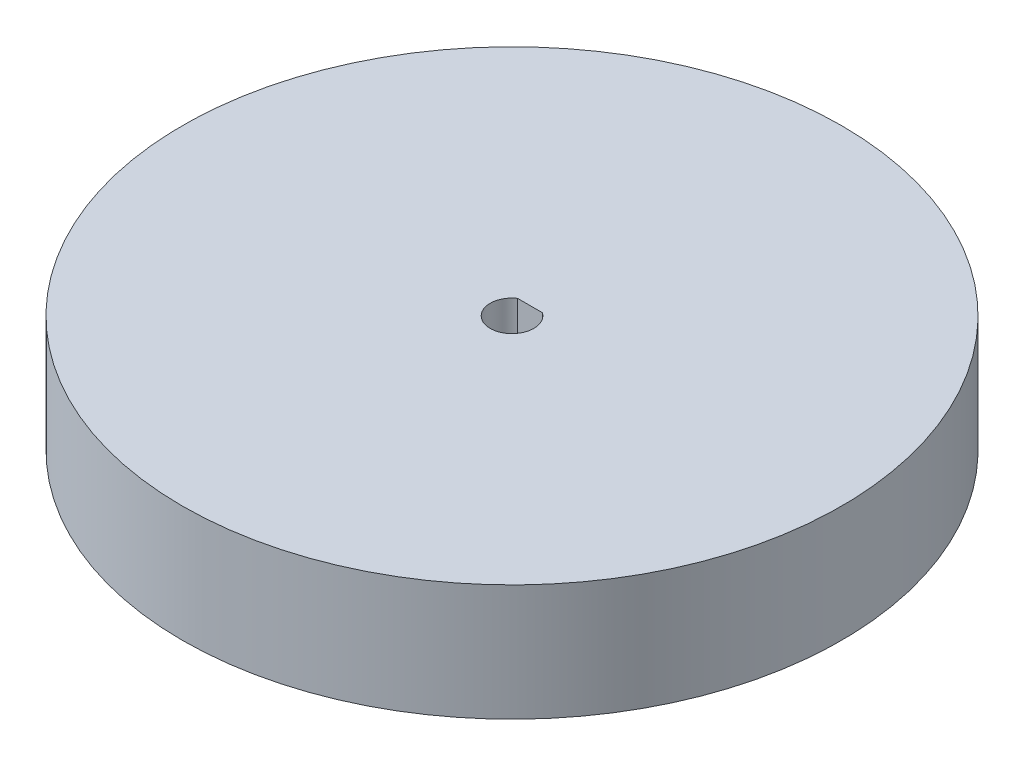
ISO-10303-21;
HEADER;
FILE_DESCRIPTION(('STEP AP214'),'2;1');
FILE_NAME('part.step','',(''),(''),'','','');
FILE_SCHEMA(('AUTOMOTIVE_DESIGN { 1 0 10303 214 1 1 1 1 }'));
ENDSEC;
DATA;
#1=APPLICATION_CONTEXT('core data for automotive mechanical design processes');
#2=APPLICATION_PROTOCOL_DEFINITION('international standard','automotive_design',2000,#1);
#3=PRODUCT_CONTEXT('',#1,'mechanical');
#4=PRODUCT('Part','Part','',(#3));
#5=PRODUCT_RELATED_PRODUCT_CATEGORY('part','',(#4));
#6=PRODUCT_DEFINITION_FORMATION('','',#4);
#7=PRODUCT_DEFINITION_CONTEXT('part definition',#1,'design');
#8=PRODUCT_DEFINITION('design','',#6,#7);
#9=PRODUCT_DEFINITION_SHAPE('','',#8);
#10=(LENGTH_UNIT() NAMED_UNIT(*) SI_UNIT(.MILLI.,.METRE.));
#11=(NAMED_UNIT(*) PLANE_ANGLE_UNIT() SI_UNIT($,.RADIAN.));
#12=(NAMED_UNIT(*) SI_UNIT($,.STERADIAN.) SOLID_ANGLE_UNIT());
#13=UNCERTAINTY_MEASURE_WITH_UNIT(LENGTH_MEASURE(1.E-05),#10,'distance_accuracy_value','');
#14=(GEOMETRIC_REPRESENTATION_CONTEXT(3) GLOBAL_UNCERTAINTY_ASSIGNED_CONTEXT((#13)) GLOBAL_UNIT_ASSIGNED_CONTEXT((#10,
#11,#12)) REPRESENTATION_CONTEXT('',''));
#15=CARTESIAN_POINT('',(0.,0.,0.));
#16=DIRECTION('',(0.,0.,1.));
#17=DIRECTION('',(1.,0.,0.));
#18=AXIS2_PLACEMENT_3D('',#15,#16,#17);
#19=CARTESIAN_POINT('',(0.,15.24,0.));
#20=DIRECTION('',(0.,1.,0.));
#21=DIRECTION('',(0.,0.,1.));
#22=AXIS2_PLACEMENT_3D('',#19,#20,#21);
#23=PLANE('',#22);
#24=CARTESIAN_POINT('',(0.,15.24,0.));
#25=DIRECTION('',(0.,1.,0.));
#26=DIRECTION('',(0.,0.,1.));
#27=AXIS2_PLACEMENT_3D('',#24,#25,#26);
#28=CIRCLE('',#27,43.18);
#29=CARTESIAN_POINT('',(0.,15.24,-43.18));
#30=VERTEX_POINT('',#29);
#31=EDGE_CURVE('E11',#30,#30,#28,.T.);
#32=ORIENTED_EDGE('',*,*,#31,.T.);
#33=EDGE_LOOP('',(#32));
#34=FACE_BOUND('',#33,.T.);
#35=CARTESIAN_POINT('',(0.,15.24,0.));
#36=DIRECTION('',(0.,1.,0.));
#37=DIRECTION('',(0.,0.,1.));
#38=AXIS2_PLACEMENT_3D('',#35,#36,#37);
#39=CIRCLE('',#38,2.8575);
#40=CARTESIAN_POINT('',(-1.62639355630794,15.24,-2.3495));
#41=VERTEX_POINT('',#40);
#42=CARTESIAN_POINT('',(1.62639355630794,15.24,-2.3495));
#43=VERTEX_POINT('',#42);
#44=EDGE_CURVE('E67',#41,#43,#39,.T.);
#45=ORIENTED_EDGE('',*,*,#44,.F.);
#46=DIRECTION('',(1.,0.,0.));
#47=VECTOR('',#46,1.);
#48=CARTESIAN_POINT('',(0.,15.24,-2.3495));
#49=LINE('',#48,#47);
#50=EDGE_CURVE('E48',#41,#43,#49,.T.);
#51=ORIENTED_EDGE('',*,*,#50,.T.);
#52=EDGE_LOOP('',(#45,#51));
#53=FACE_BOUND('',#52,.T.);
#54=ADVANCED_FACE('F33',(#34,#53),#23,.T.);
#55=CARTESIAN_POINT('',(0.,0.,0.));
#56=DIRECTION('',(0.,1.,0.));
#57=DIRECTION('',(0.,0.,1.));
#58=AXIS2_PLACEMENT_3D('',#55,#56,#57);
#59=PLANE('',#58);
#60=CARTESIAN_POINT('',(0.,0.,0.));
#61=DIRECTION('',(0.,1.,0.));
#62=DIRECTION('',(0.,0.,1.));
#63=AXIS2_PLACEMENT_3D('',#60,#61,#62);
#64=CIRCLE('',#63,43.18);
#65=CARTESIAN_POINT('',(0.,0.,-43.18));
#66=VERTEX_POINT('',#65);
#67=EDGE_CURVE('E37',#66,#66,#64,.T.);
#68=ORIENTED_EDGE('',*,*,#67,.F.);
#69=EDGE_LOOP('',(#68));
#70=FACE_BOUND('',#69,.T.);
#71=DIRECTION('',(1.,0.,0.));
#72=VECTOR('',#71,1.);
#73=CARTESIAN_POINT('',(0.,0.,-2.3495));
#74=LINE('',#73,#72);
#75=CARTESIAN_POINT('',(-1.62639355630794,0.,-2.3495));
#76=VERTEX_POINT('',#75);
#77=CARTESIAN_POINT('',(1.62639355630794,0.,-2.3495));
#78=VERTEX_POINT('',#77);
#79=EDGE_CURVE('E62',#76,#78,#74,.T.);
#80=ORIENTED_EDGE('',*,*,#79,.F.);
#81=CARTESIAN_POINT('',(0.,0.,0.));
#82=DIRECTION('',(0.,1.,0.));
#83=DIRECTION('',(0.,0.,1.));
#84=AXIS2_PLACEMENT_3D('',#81,#82,#83);
#85=CIRCLE('',#84,2.8575);
#86=EDGE_CURVE('E73',#76,#78,#85,.T.);
#87=ORIENTED_EDGE('',*,*,#86,.T.);
#88=EDGE_LOOP('',(#80,#87));
#89=FACE_BOUND('',#88,.T.);
#90=ADVANCED_FACE('F77',(#70,#89),#59,.F.);
#91=CARTESIAN_POINT('',(0.,15.24,0.));
#92=DIRECTION('',(0.,-1.,0.));
#93=DIRECTION('',(0.,0.,-1.));
#94=AXIS2_PLACEMENT_3D('',#91,#92,#93);
#95=CYLINDRICAL_SURFACE('',#94,43.18);
#96=CARTESIAN_POINT('',(0.,15.24,-43.18));
#97=CARTESIAN_POINT('',(0.,15.08125,-43.18));
#98=CARTESIAN_POINT('',(0.,14.9225,-43.18));
#99=CARTESIAN_POINT('',(0.,14.605,-43.18));
#100=CARTESIAN_POINT('',(0.,14.44625,-43.18));
#101=CARTESIAN_POINT('',(0.,14.12875,-43.18));
#102=CARTESIAN_POINT('',(0.,13.97,-43.18));
#103=CARTESIAN_POINT('',(0.,13.6525,-43.18));
#104=CARTESIAN_POINT('',(0.,13.49375,-43.18));
#105=CARTESIAN_POINT('',(0.,13.17625,-43.18));
#106=CARTESIAN_POINT('',(0.,13.0175,-43.18));
#107=CARTESIAN_POINT('',(0.,12.7,-43.18));
#108=CARTESIAN_POINT('',(0.,12.54125,-43.18));
#109=CARTESIAN_POINT('',(0.,12.22375,-43.18));
#110=CARTESIAN_POINT('',(0.,12.065,-43.18));
#111=CARTESIAN_POINT('',(0.,11.7475,-43.18));
#112=CARTESIAN_POINT('',(0.,11.58875,-43.18));
#113=CARTESIAN_POINT('',(0.,11.27125,-43.18));
#114=CARTESIAN_POINT('',(0.,11.1125,-43.18));
#115=CARTESIAN_POINT('',(0.,10.795,-43.18));
#116=CARTESIAN_POINT('',(0.,10.63625,-43.18));
#117=CARTESIAN_POINT('',(0.,10.31875,-43.18));
#118=CARTESIAN_POINT('',(0.,10.16,-43.18));
#119=CARTESIAN_POINT('',(0.,9.8425,-43.18));
#120=CARTESIAN_POINT('',(0.,9.68375,-43.18));
#121=CARTESIAN_POINT('',(0.,9.36625,-43.18));
#122=CARTESIAN_POINT('',(0.,9.2075,-43.18));
#123=CARTESIAN_POINT('',(0.,8.89,-43.18));
#124=CARTESIAN_POINT('',(0.,8.73125,-43.18));
#125=CARTESIAN_POINT('',(0.,8.41375,-43.18));
#126=CARTESIAN_POINT('',(0.,8.255,-43.18));
#127=CARTESIAN_POINT('',(0.,7.9375,-43.18));
#128=CARTESIAN_POINT('',(0.,7.77875,-43.18));
#129=CARTESIAN_POINT('',(0.,7.46125,-43.18));
#130=CARTESIAN_POINT('',(0.,7.3025,-43.18));
#131=CARTESIAN_POINT('',(0.,6.985,-43.18));
#132=CARTESIAN_POINT('',(0.,6.82625,-43.18));
#133=CARTESIAN_POINT('',(0.,6.50875,-43.18));
#134=CARTESIAN_POINT('',(0.,6.35,-43.18));
#135=CARTESIAN_POINT('',(0.,6.0325,-43.18));
#136=CARTESIAN_POINT('',(0.,5.87375,-43.18));
#137=CARTESIAN_POINT('',(0.,5.55625,-43.18));
#138=CARTESIAN_POINT('',(0.,5.3975,-43.18));
#139=CARTESIAN_POINT('',(0.,5.08,-43.18));
#140=CARTESIAN_POINT('',(0.,4.92125,-43.18));
#141=CARTESIAN_POINT('',(0.,4.60375,-43.18));
#142=CARTESIAN_POINT('',(0.,4.445,-43.18));
#143=CARTESIAN_POINT('',(0.,4.1275,-43.18));
#144=CARTESIAN_POINT('',(0.,3.96875,-43.18));
#145=CARTESIAN_POINT('',(0.,3.65125,-43.18));
#146=CARTESIAN_POINT('',(0.,3.4925,-43.18));
#147=CARTESIAN_POINT('',(0.,3.175,-43.18));
#148=CARTESIAN_POINT('',(0.,3.01625,-43.18));
#149=CARTESIAN_POINT('',(0.,2.69875,-43.18));
#150=CARTESIAN_POINT('',(0.,2.54,-43.18));
#151=CARTESIAN_POINT('',(0.,2.2225,-43.18));
#152=CARTESIAN_POINT('',(0.,2.06375,-43.18));
#153=CARTESIAN_POINT('',(0.,1.74625,-43.18));
#154=CARTESIAN_POINT('',(0.,1.5875,-43.18));
#155=CARTESIAN_POINT('',(0.,1.27,-43.18));
#156=CARTESIAN_POINT('',(0.,1.11125,-43.18));
#157=CARTESIAN_POINT('',(0.,0.79375,-43.18));
#158=CARTESIAN_POINT('',(0.,0.634999999999999,-43.18));
#159=CARTESIAN_POINT('',(0.,0.3175,-43.18));
#160=CARTESIAN_POINT('',(0.,0.15875,-43.18));
#161=CARTESIAN_POINT('',(0.,0.,-43.18));
#162=B_SPLINE_CURVE_WITH_KNOTS('',3,(#96,#97,#98,#99,#100,#101,#102,#103,#104,#105,#106,#107,
#108,#109,#110,#111,#112,#113,#114,#115,#116,#117,#118,#119,#120,#121,#122,#123,#124,#125,#126,
#127,#128,#129,#130,#131,#132,#133,#134,#135,#136,#137,#138,#139,#140,#141,#142,#143,#144,#145,
#146,#147,#148,#149,#150,#151,#152,#153,#154,#155,#156,#157,#158,#159,#160,#161),.UNSPECIFIED.,
.F.,.F.,(4,2,2,2,2,2,2,2,2,2,2,2,2,2,2,2,2,2,2,2,2,2,2,2,2,2,2,2,2,2,2,2,4),(0.,
0.476249999999999,0.952499999999998,1.42875,1.905,2.38125,2.8575,3.33375,3.81,4.28625,4.7625,
5.23875,5.715,6.19125,6.6675,7.14375,7.62,8.09625,8.5725,9.04875,9.525,10.00125,10.4775,
10.95375,11.43,11.90625,12.3825,12.85875,13.335,13.81125,14.2875,14.76375,15.24),.UNSPECIFIED.);
#163=EDGE_CURVE('BSEAM35',#30,#66,#162,.T.);
#164=ORIENTED_EDGE('',*,*,#31,.F.);
#165=ORIENTED_EDGE('',*,*,#67,.T.);
#166=ORIENTED_EDGE('',*,*,#163,.T.);
#167=ORIENTED_EDGE('',*,*,#163,.F.);
#168=EDGE_LOOP('',(#164,#166,#165,#167));
#169=FACE_BOUND('',#168,.T.);
#170=ADVANCED_FACE('F35',(#169),#95,.T.);
#171=CARTESIAN_POINT('',(0.,0.,-2.3495));
#172=DIRECTION('',(0.,0.,1.));
#173=DIRECTION('',(1.,0.,0.));
#174=AXIS2_PLACEMENT_3D('',#171,#172,#173);
#175=PLANE('',#174);
#176=ORIENTED_EDGE('',*,*,#50,.F.);
#177=DIRECTION('',(0.,1.,0.));
#178=VECTOR('',#177,1.);
#179=CARTESIAN_POINT('',(-1.62639355630794,0.,-2.3495));
#180=LINE('',#179,#178);
#181=EDGE_CURVE('E64',#76,#41,#180,.T.);
#182=ORIENTED_EDGE('',*,*,#181,.F.);
#183=ORIENTED_EDGE('',*,*,#79,.T.);
#184=DIRECTION('',(0.,1.,0.));
#185=VECTOR('',#184,1.);
#186=CARTESIAN_POINT('',(1.62639355630794,0.,-2.3495));
#187=LINE('',#186,#185);
#188=EDGE_CURVE('E55',#78,#43,#187,.T.);
#189=ORIENTED_EDGE('',*,*,#188,.T.);
#190=EDGE_LOOP('',(#176,#182,#183,#189));
#191=FACE_BOUND('',#190,.T.);
#192=ADVANCED_FACE('F60',(#191),#175,.T.);
#193=CARTESIAN_POINT('',(0.,0.,0.));
#194=DIRECTION('',(0.,1.,0.));
#195=DIRECTION('',(0.,0.,1.));
#196=AXIS2_PLACEMENT_3D('',#193,#194,#195);
#197=CYLINDRICAL_SURFACE('',#196,2.8575);
#198=ORIENTED_EDGE('',*,*,#44,.T.);
#199=ORIENTED_EDGE('',*,*,#188,.F.);
#200=ORIENTED_EDGE('',*,*,#86,.F.);
#201=ORIENTED_EDGE('',*,*,#181,.T.);
#202=EDGE_LOOP('',(#198,#199,#200,#201));
#203=FACE_BOUND('',#202,.T.);
#204=ADVANCED_FACE('F68',(#203),#197,.F.);
#205=CLOSED_SHELL('',(#54,#90,#170,#192,#204));
#206=MANIFOLD_SOLID_BREP('B2',#205);
#207=ADVANCED_BREP_SHAPE_REPRESENTATION('',(#18,#206),#14);
#208=SHAPE_DEFINITION_REPRESENTATION(#9,#207);
ENDSEC;
END-ISO-10303-21;
